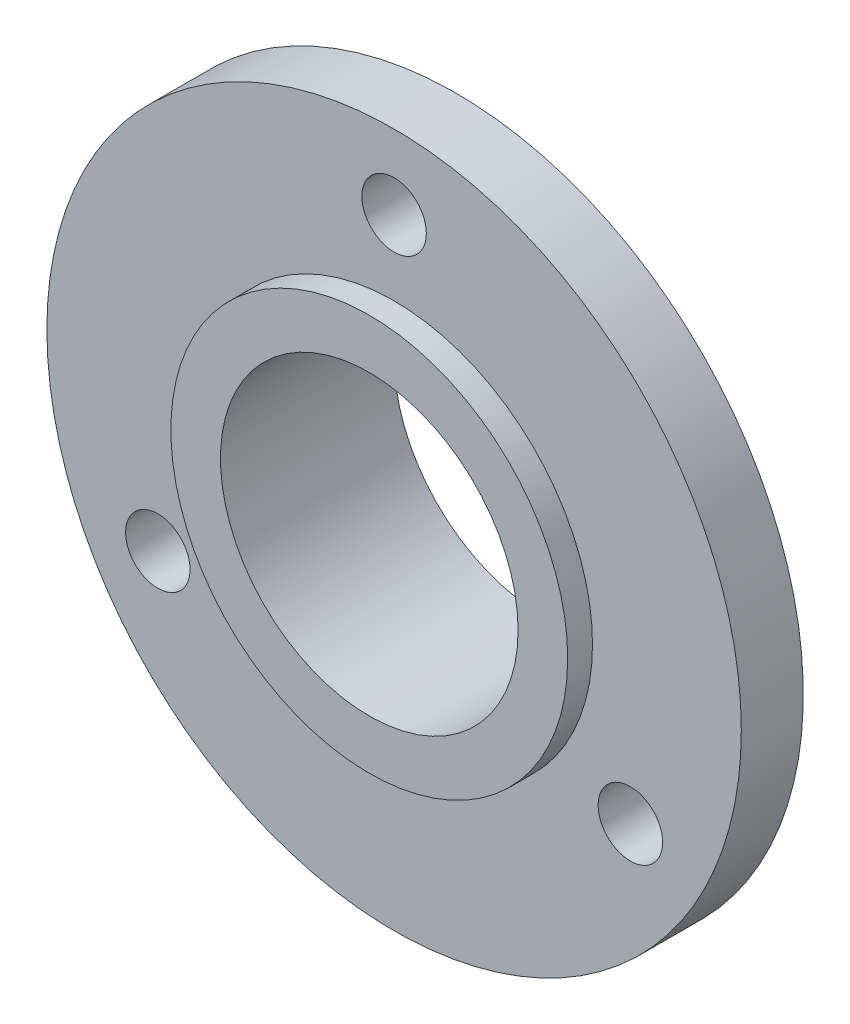
ISO-10303-21;
HEADER;
FILE_DESCRIPTION(('STEP AP214'),'2;1');
FILE_NAME('part.step','',(''),(''),'','','');
FILE_SCHEMA(('AUTOMOTIVE_DESIGN { 1 0 10303 214 1 1 1 1 }'));
ENDSEC;
DATA;
#1=APPLICATION_CONTEXT('core data for automotive mechanical design processes');
#2=APPLICATION_PROTOCOL_DEFINITION('international standard','automotive_design',2000,#1);
#3=PRODUCT_CONTEXT('',#1,'mechanical');
#4=PRODUCT('Part','Part','',(#3));
#5=PRODUCT_RELATED_PRODUCT_CATEGORY('part','',(#4));
#6=PRODUCT_DEFINITION_FORMATION('','',#4);
#7=PRODUCT_DEFINITION_CONTEXT('part definition',#1,'design');
#8=PRODUCT_DEFINITION('design','',#6,#7);
#9=PRODUCT_DEFINITION_SHAPE('','',#8);
#10=(LENGTH_UNIT() NAMED_UNIT(*) SI_UNIT(.MILLI.,.METRE.));
#11=(NAMED_UNIT(*) PLANE_ANGLE_UNIT() SI_UNIT($,.RADIAN.));
#12=(NAMED_UNIT(*) SI_UNIT($,.STERADIAN.) SOLID_ANGLE_UNIT());
#13=UNCERTAINTY_MEASURE_WITH_UNIT(LENGTH_MEASURE(1.E-05),#10,'distance_accuracy_value','');
#14=(GEOMETRIC_REPRESENTATION_CONTEXT(3) GLOBAL_UNCERTAINTY_ASSIGNED_CONTEXT((#13)) GLOBAL_UNIT_ASSIGNED_CONTEXT((#10,
#11,#12)) REPRESENTATION_CONTEXT('',''));
#15=CARTESIAN_POINT('',(0.,0.,0.));
#16=DIRECTION('',(0.,0.,1.));
#17=DIRECTION('',(1.,0.,0.));
#18=AXIS2_PLACEMENT_3D('',#15,#16,#17);
#19=CARTESIAN_POINT('',(0.,0.,7.));
#20=DIRECTION('',(0.,0.,-1.));
#21=DIRECTION('',(-1.,0.,0.));
#22=AXIS2_PLACEMENT_3D('',#19,#20,#21);
#23=CYLINDRICAL_SURFACE('',#22,14.);
#24=CARTESIAN_POINT('',(0.,0.,6.));
#25=DIRECTION('',(0.,0.,1.));
#26=DIRECTION('',(1.,0.,0.));
#27=AXIS2_PLACEMENT_3D('',#24,#25,#26);
#28=CIRCLE('',#27,14.);
#29=CARTESIAN_POINT('',(14.,0.,6.));
#30=VERTEX_POINT('',#29);
#31=EDGE_CURVE('E45',#30,#30,#28,.T.);
#32=ORIENTED_EDGE('',*,*,#31,.F.);
#33=EDGE_LOOP('',(#32));
#34=FACE_BOUND('',#33,.T.);
#35=CARTESIAN_POINT('',(0.,0.,3.5));
#36=DIRECTION('',(0.,0.,-1.));
#37=DIRECTION('',(-1.,0.,0.));
#38=AXIS2_PLACEMENT_3D('',#35,#36,#37);
#39=CIRCLE('',#38,14.);
#40=CARTESIAN_POINT('',(-14.,0.,3.5));
#41=VERTEX_POINT('',#40);
#42=EDGE_CURVE('E50',#41,#41,#39,.T.);
#43=ORIENTED_EDGE('',*,*,#42,.F.);
#44=EDGE_LOOP('',(#43));
#45=FACE_BOUND('',#44,.T.);
#46=ADVANCED_FACE('F33',(#34,#45),#23,.T.);
#47=CARTESIAN_POINT('',(0.,0.,0.));
#48=DIRECTION('',(0.,0.,1.));
#49=DIRECTION('',(1.,0.,0.));
#50=AXIS2_PLACEMENT_3D('',#47,#48,#49);
#51=PLANE('',#50);
#52=CARTESIAN_POINT('',(0.,0.,0.));
#53=DIRECTION('',(0.,0.,1.));
#54=DIRECTION('',(1.,0.,0.));
#55=AXIS2_PLACEMENT_3D('',#52,#53,#54);
#56=CIRCLE('',#55,6.);
#57=CARTESIAN_POINT('',(6.,0.,0.));
#58=VERTEX_POINT('',#57);
#59=EDGE_CURVE('E40',#58,#58,#56,.T.);
#60=ORIENTED_EDGE('',*,*,#59,.T.);
#61=EDGE_LOOP('',(#60));
#62=FACE_BOUND('',#61,.T.);
#63=CARTESIAN_POINT('',(0.,0.,0.));
#64=DIRECTION('',(0.,0.,-1.));
#65=DIRECTION('',(-1.,0.,0.));
#66=AXIS2_PLACEMENT_3D('',#63,#64,#65);
#67=CIRCLE('',#66,8.);
#68=CARTESIAN_POINT('',(-8.,0.,0.));
#69=VERTEX_POINT('',#68);
#70=EDGE_CURVE('E74',#69,#69,#67,.T.);
#71=ORIENTED_EDGE('',*,*,#70,.T.);
#72=EDGE_LOOP('',(#71));
#73=FACE_BOUND('',#72,.T.);
#74=ADVANCED_FACE('F102',(#62,#73),#51,.F.);
#75=CARTESIAN_POINT('',(0.,0.,7.));
#76=DIRECTION('',(0.,0.,1.));
#77=DIRECTION('',(1.,0.,0.));
#78=AXIS2_PLACEMENT_3D('',#75,#76,#77);
#79=PLANE('',#78);
#80=CARTESIAN_POINT('',(0.,0.,7.));
#81=DIRECTION('',(0.,0.,1.));
#82=DIRECTION('',(1.,0.,0.));
#83=AXIS2_PLACEMENT_3D('',#80,#81,#82);
#84=CIRCLE('',#83,6.);
#85=CARTESIAN_POINT('',(6.,0.,7.));
#86=VERTEX_POINT('',#85);
#87=EDGE_CURVE('E11',#86,#86,#84,.T.);
#88=ORIENTED_EDGE('',*,*,#87,.F.);
#89=EDGE_LOOP('',(#88));
#90=FACE_BOUND('',#89,.T.);
#91=CARTESIAN_POINT('',(0.,0.,7.));
#92=DIRECTION('',(0.,0.,1.));
#93=DIRECTION('',(1.,0.,0.));
#94=AXIS2_PLACEMENT_3D('',#91,#92,#93);
#95=CIRCLE('',#94,8.);
#96=CARTESIAN_POINT('',(8.,0.,7.));
#97=VERTEX_POINT('',#96);
#98=EDGE_CURVE('E53',#97,#97,#95,.T.);
#99=ORIENTED_EDGE('',*,*,#98,.T.);
#100=EDGE_LOOP('',(#99));
#101=FACE_BOUND('',#100,.T.);
#102=ADVANCED_FACE('F84',(#90,#101),#79,.T.);
#103=CARTESIAN_POINT('',(0.,0.,7.));
#104=DIRECTION('',(0.,0.,-1.));
#105=DIRECTION('',(-1.,0.,0.));
#106=AXIS2_PLACEMENT_3D('',#103,#104,#105);
#107=CYLINDRICAL_SURFACE('',#106,6.);
#108=ORIENTED_EDGE('',*,*,#87,.T.);
#109=EDGE_LOOP('',(#108));
#110=FACE_BOUND('',#109,.T.);
#111=ORIENTED_EDGE('',*,*,#59,.F.);
#112=EDGE_LOOP('',(#111));
#113=FACE_BOUND('',#112,.T.);
#114=ADVANCED_FACE('F99',(#110,#113),#107,.F.);
#115=CARTESIAN_POINT('',(0.,0.,6.));
#116=DIRECTION('',(0.,0.,1.));
#117=DIRECTION('',(1.,0.,0.));
#118=AXIS2_PLACEMENT_3D('',#115,#116,#117);
#119=PLANE('',#118);
#120=CARTESIAN_POINT('',(-9.52627944162887,-5.49999999999991,6.));
#121=DIRECTION('',(0.,0.,1.));
#122=DIRECTION('',(1.,0.,0.));
#123=AXIS2_PLACEMENT_3D('',#120,#121,#122);
#124=CIRCLE('',#123,1.3);
#125=CARTESIAN_POINT('',(-8.22627944162887,-5.49999999999991,6.));
#126=VERTEX_POINT('',#125);
#127=EDGE_CURVE('E61',#126,#126,#124,.F.);
#128=ORIENTED_EDGE('',*,*,#127,.T.);
#129=EDGE_LOOP('',(#128));
#130=FACE_BOUND('',#129,.T.);
#131=CARTESIAN_POINT('',(9.5262794416288,-5.50000000000004,6.));
#132=DIRECTION('',(0.,0.,1.));
#133=DIRECTION('',(1.,0.,0.));
#134=AXIS2_PLACEMENT_3D('',#131,#132,#133);
#135=CIRCLE('',#134,1.3);
#136=CARTESIAN_POINT('',(10.8262794416288,-5.50000000000004,6.));
#137=VERTEX_POINT('',#136);
#138=EDGE_CURVE('E58',#137,#137,#135,.F.);
#139=ORIENTED_EDGE('',*,*,#138,.T.);
#140=EDGE_LOOP('',(#139));
#141=FACE_BOUND('',#140,.T.);
#142=CARTESIAN_POINT('',(0.,11.,6.));
#143=DIRECTION('',(0.,0.,1.));
#144=DIRECTION('',(1.,0.,0.));
#145=AXIS2_PLACEMENT_3D('',#142,#143,#144);
#146=CIRCLE('',#145,1.3);
#147=CARTESIAN_POINT('',(1.3,11.,6.));
#148=VERTEX_POINT('',#147);
#149=EDGE_CURVE('E57',#148,#148,#146,.F.);
#150=ORIENTED_EDGE('',*,*,#149,.T.);
#151=EDGE_LOOP('',(#150));
#152=FACE_BOUND('',#151,.T.);
#153=CARTESIAN_POINT('',(0.,0.,6.));
#154=DIRECTION('',(0.,0.,1.));
#155=DIRECTION('',(1.,0.,0.));
#156=AXIS2_PLACEMENT_3D('',#153,#154,#155);
#157=CIRCLE('',#156,8.);
#158=CARTESIAN_POINT('',(8.,0.,6.));
#159=VERTEX_POINT('',#158);
#160=EDGE_CURVE('E79',#159,#159,#157,.T.);
#161=ORIENTED_EDGE('',*,*,#160,.F.);
#162=EDGE_LOOP('',(#161));
#163=FACE_BOUND('',#162,.T.);
#164=ORIENTED_EDGE('',*,*,#31,.T.);
#165=EDGE_LOOP('',(#164));
#166=FACE_BOUND('',#165,.T.);
#167=ADVANCED_FACE('F89',(#130,#141,#152,#163,#166),#119,.T.);
#168=CARTESIAN_POINT('',(0.,0.,6.));
#169=DIRECTION('',(0.,0.,1.));
#170=DIRECTION('',(1.,0.,0.));
#171=AXIS2_PLACEMENT_3D('',#168,#169,#170);
#172=CYLINDRICAL_SURFACE('',#171,8.);
#173=ORIENTED_EDGE('',*,*,#160,.T.);
#174=EDGE_LOOP('',(#173));
#175=FACE_BOUND('',#174,.T.);
#176=ORIENTED_EDGE('',*,*,#98,.F.);
#177=EDGE_LOOP('',(#176));
#178=FACE_BOUND('',#177,.T.);
#179=ADVANCED_FACE('F86',(#175,#178),#172,.T.);
#180=CARTESIAN_POINT('',(0.,0.,3.5));
#181=DIRECTION('',(0.,0.,-1.));
#182=DIRECTION('',(-1.,0.,0.));
#183=AXIS2_PLACEMENT_3D('',#180,#181,#182);
#184=PLANE('',#183);
#185=CARTESIAN_POINT('',(-9.52627944162887,-5.49999999999991,3.5));
#186=DIRECTION('',(0.,0.,-1.));
#187=DIRECTION('',(-1.,0.,0.));
#188=AXIS2_PLACEMENT_3D('',#185,#186,#187);
#189=CIRCLE('',#188,1.3);
#190=CARTESIAN_POINT('',(-10.8262794416289,-5.49999999999991,3.5));
#191=VERTEX_POINT('',#190);
#192=EDGE_CURVE('E36',#191,#191,#189,.F.);
#193=ORIENTED_EDGE('',*,*,#192,.T.);
#194=EDGE_LOOP('',(#193));
#195=FACE_BOUND('',#194,.T.);
#196=CARTESIAN_POINT('',(9.5262794416288,-5.50000000000004,3.5));
#197=DIRECTION('',(0.,0.,-1.));
#198=DIRECTION('',(-1.,0.,0.));
#199=AXIS2_PLACEMENT_3D('',#196,#197,#198);
#200=CIRCLE('',#199,1.3);
#201=CARTESIAN_POINT('',(8.2262794416288,-5.50000000000004,3.5));
#202=VERTEX_POINT('',#201);
#203=EDGE_CURVE('E59',#202,#202,#200,.F.);
#204=ORIENTED_EDGE('',*,*,#203,.T.);
#205=EDGE_LOOP('',(#204));
#206=FACE_BOUND('',#205,.T.);
#207=CARTESIAN_POINT('',(0.,11.,3.5));
#208=DIRECTION('',(0.,0.,-1.));
#209=DIRECTION('',(-1.,0.,0.));
#210=AXIS2_PLACEMENT_3D('',#207,#208,#209);
#211=CIRCLE('',#210,1.3);
#212=CARTESIAN_POINT('',(-1.3,11.,3.5));
#213=VERTEX_POINT('',#212);
#214=EDGE_CURVE('E55',#213,#213,#211,.F.);
#215=ORIENTED_EDGE('',*,*,#214,.T.);
#216=EDGE_LOOP('',(#215));
#217=FACE_BOUND('',#216,.T.);
#218=CARTESIAN_POINT('',(0.,0.,3.5));
#219=DIRECTION('',(0.,0.,-1.));
#220=DIRECTION('',(-1.,0.,0.));
#221=AXIS2_PLACEMENT_3D('',#218,#219,#220);
#222=CIRCLE('',#221,8.);
#223=CARTESIAN_POINT('',(-8.,0.,3.5));
#224=VERTEX_POINT('',#223);
#225=EDGE_CURVE('E54',#224,#224,#222,.T.);
#226=ORIENTED_EDGE('',*,*,#225,.F.);
#227=EDGE_LOOP('',(#226));
#228=FACE_BOUND('',#227,.T.);
#229=ORIENTED_EDGE('',*,*,#42,.T.);
#230=EDGE_LOOP('',(#229));
#231=FACE_BOUND('',#230,.T.);
#232=ADVANCED_FACE('F88',(#195,#206,#217,#228,#231),#184,.T.);
#233=CARTESIAN_POINT('',(0.,0.,3.5));
#234=DIRECTION('',(0.,0.,-1.));
#235=DIRECTION('',(-1.,0.,0.));
#236=AXIS2_PLACEMENT_3D('',#233,#234,#235);
#237=CYLINDRICAL_SURFACE('',#236,8.);
#238=ORIENTED_EDGE('',*,*,#225,.T.);
#239=EDGE_LOOP('',(#238));
#240=FACE_BOUND('',#239,.T.);
#241=ORIENTED_EDGE('',*,*,#70,.F.);
#242=EDGE_LOOP('',(#241));
#243=FACE_BOUND('',#242,.T.);
#244=ADVANCED_FACE('F96',(#240,#243),#237,.T.);
#245=CARTESIAN_POINT('',(0.,11.,8.));
#246=DIRECTION('',(0.,0.,-1.));
#247=DIRECTION('',(-1.,0.,0.));
#248=AXIS2_PLACEMENT_3D('',#245,#246,#247);
#249=CYLINDRICAL_SURFACE('',#248,1.3);
#250=ORIENTED_EDGE('',*,*,#149,.F.);
#251=EDGE_LOOP('',(#250));
#252=FACE_BOUND('',#251,.T.);
#253=ORIENTED_EDGE('',*,*,#214,.F.);
#254=EDGE_LOOP('',(#253));
#255=FACE_BOUND('',#254,.T.);
#256=ADVANCED_FACE('F140',(#252,#255),#249,.F.);
#257=CARTESIAN_POINT('',(9.5262794416288,-5.50000000000004,8.));
#258=DIRECTION('',(0.,0.,-1.));
#259=DIRECTION('',(-1.,0.,0.));
#260=AXIS2_PLACEMENT_3D('',#257,#258,#259);
#261=CYLINDRICAL_SURFACE('',#260,1.3);
#262=ORIENTED_EDGE('',*,*,#138,.F.);
#263=EDGE_LOOP('',(#262));
#264=FACE_BOUND('',#263,.T.);
#265=ORIENTED_EDGE('',*,*,#203,.F.);
#266=EDGE_LOOP('',(#265));
#267=FACE_BOUND('',#266,.T.);
#268=ADVANCED_FACE('F154',(#264,#267),#261,.F.);
#269=CARTESIAN_POINT('',(-9.52627944162887,-5.49999999999991,8.));
#270=DIRECTION('',(0.,0.,-1.));
#271=DIRECTION('',(-1.,0.,0.));
#272=AXIS2_PLACEMENT_3D('',#269,#270,#271);
#273=CYLINDRICAL_SURFACE('',#272,1.3);
#274=ORIENTED_EDGE('',*,*,#127,.F.);
#275=EDGE_LOOP('',(#274));
#276=FACE_BOUND('',#275,.T.);
#277=ORIENTED_EDGE('',*,*,#192,.F.);
#278=EDGE_LOOP('',(#277));
#279=FACE_BOUND('',#278,.T.);
#280=ADVANCED_FACE('F159',(#276,#279),#273,.F.);
#281=CLOSED_SHELL('',(#46,#74,#102,#114,#167,#179,#232,#244,#256,#268,#280));
#282=MANIFOLD_SOLID_BREP('B2',#281);
#283=ADVANCED_BREP_SHAPE_REPRESENTATION('',(#18,#282),#14);
#284=SHAPE_DEFINITION_REPRESENTATION(#9,#283);
ENDSEC;
END-ISO-10303-21;
